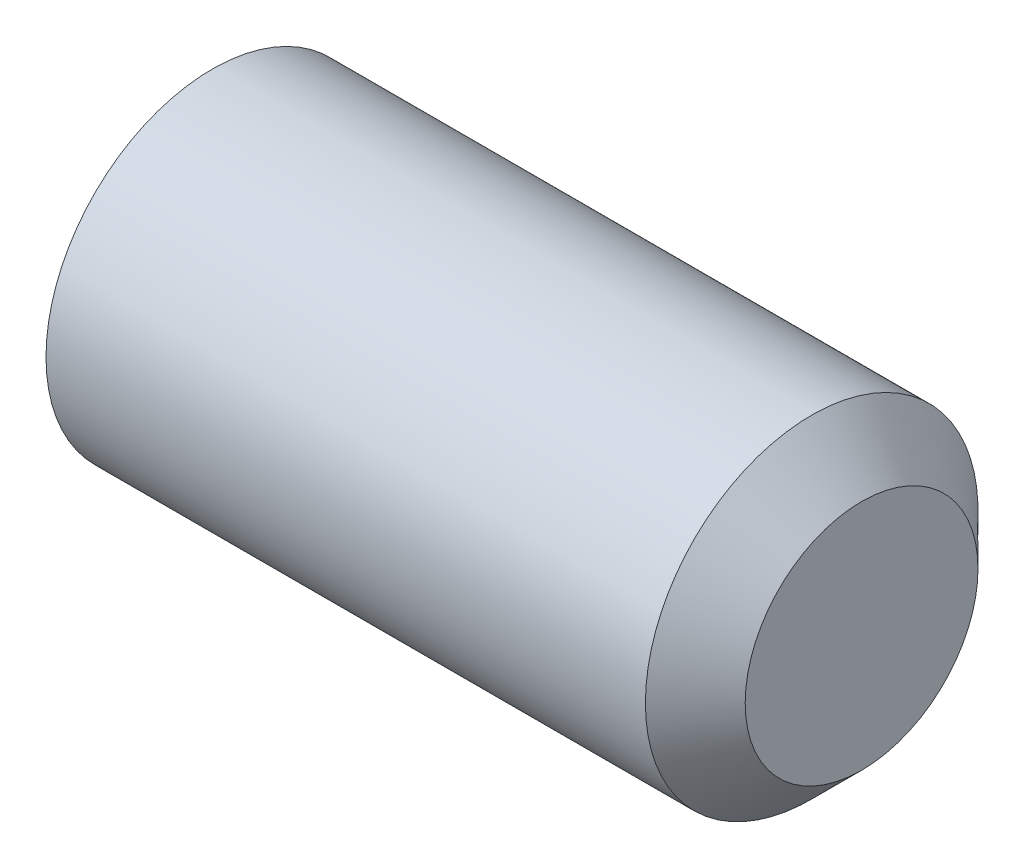
ISO-10303-21;
HEADER;
FILE_DESCRIPTION(('STEP AP214'),'2;1');
FILE_NAME('part.step','',(''),(''),'','','');
FILE_SCHEMA(('AUTOMOTIVE_DESIGN { 1 0 10303 214 1 1 1 1 }'));
ENDSEC;
DATA;
#1=APPLICATION_CONTEXT('core data for automotive mechanical design processes');
#2=APPLICATION_PROTOCOL_DEFINITION('international standard','automotive_design',2000,#1);
#3=PRODUCT_CONTEXT('',#1,'mechanical');
#4=PRODUCT('Part','Part','',(#3));
#5=PRODUCT_RELATED_PRODUCT_CATEGORY('part','',(#4));
#6=PRODUCT_DEFINITION_FORMATION('','',#4);
#7=PRODUCT_DEFINITION_CONTEXT('part definition',#1,'design');
#8=PRODUCT_DEFINITION('design','',#6,#7);
#9=PRODUCT_DEFINITION_SHAPE('','',#8);
#10=(LENGTH_UNIT() NAMED_UNIT(*) SI_UNIT(.MILLI.,.METRE.));
#11=(NAMED_UNIT(*) PLANE_ANGLE_UNIT() SI_UNIT($,.RADIAN.));
#12=(NAMED_UNIT(*) SI_UNIT($,.STERADIAN.) SOLID_ANGLE_UNIT());
#13=UNCERTAINTY_MEASURE_WITH_UNIT(LENGTH_MEASURE(1.E-05),#10,'distance_accuracy_value','');
#14=(GEOMETRIC_REPRESENTATION_CONTEXT(3) GLOBAL_UNCERTAINTY_ASSIGNED_CONTEXT((#13)) GLOBAL_UNIT_ASSIGNED_CONTEXT((#10,
#11,#12)) REPRESENTATION_CONTEXT('',''));
#15=CARTESIAN_POINT('',(0.,0.,0.));
#16=DIRECTION('',(0.,0.,1.));
#17=DIRECTION('',(1.,0.,0.));
#18=AXIS2_PLACEMENT_3D('',#15,#16,#17);
#19=CARTESIAN_POINT('',(0.,0.,0.));
#20=DIRECTION('',(-1.,0.,0.));
#21=DIRECTION('',(0.,0.,1.));
#22=AXIS2_PLACEMENT_3D('',#19,#20,#21);
#23=PLANE('',#22);
#24=CARTESIAN_POINT('',(0.,0.,0.));
#25=DIRECTION('',(-1.,0.,0.));
#26=DIRECTION('',(0.,0.,1.));
#27=AXIS2_PLACEMENT_3D('',#24,#25,#26);
#28=CIRCLE('',#27,4.172);
#29=CARTESIAN_POINT('',(0.,0.,4.172));
#30=VERTEX_POINT('',#29);
#31=EDGE_CURVE('E180',#30,#30,#28,.T.);
#32=ORIENTED_EDGE('',*,*,#31,.T.);
#33=EDGE_LOOP('',(#32));
#34=FACE_BOUND('',#33,.T.);
#35=DIRECTION('',(0.,0.,-1.));
#36=VECTOR('',#35,1.);
#37=CARTESIAN_POINT('',(0.,2.5,1.44337567297406));
#38=LINE('',#37,#36);
#39=CARTESIAN_POINT('',(0.,2.5,1.44337567297406));
#40=VERTEX_POINT('',#39);
#41=CARTESIAN_POINT('',(0.,2.5,-1.44337567297406));
#42=VERTEX_POINT('',#41);
#43=EDGE_CURVE('E165',#40,#42,#38,.T.);
#44=ORIENTED_EDGE('',*,*,#43,.F.);
#45=DIRECTION('',(0.,-0.866025403784438,0.500000000000001));
#46=VECTOR('',#45,1.);
#47=CARTESIAN_POINT('',(0.,2.5,1.44337567297406));
#48=LINE('',#47,#46);
#49=CARTESIAN_POINT('',(0.,0.,2.88675134594813));
#50=VERTEX_POINT('',#49);
#51=EDGE_CURVE('E78',#40,#50,#48,.T.);
#52=ORIENTED_EDGE('',*,*,#51,.T.);
#53=DIRECTION('',(0.,0.866025403784439,0.5));
#54=VECTOR('',#53,1.);
#55=CARTESIAN_POINT('',(0.,-2.5,1.44337567297407));
#56=LINE('',#55,#54);
#57=CARTESIAN_POINT('',(0.,-2.5,1.44337567297407));
#58=VERTEX_POINT('',#57);
#59=EDGE_CURVE('E152',#58,#50,#56,.T.);
#60=ORIENTED_EDGE('',*,*,#59,.F.);
#61=DIRECTION('',(0.,0.,-1.));
#62=VECTOR('',#61,1.);
#63=CARTESIAN_POINT('',(0.,-2.5,1.44337567297407));
#64=LINE('',#63,#62);
#65=CARTESIAN_POINT('',(0.,-2.5,-1.44337567297406));
#66=VERTEX_POINT('',#65);
#67=EDGE_CURVE('E156',#58,#66,#64,.T.);
#68=ORIENTED_EDGE('',*,*,#67,.T.);
#69=DIRECTION('',(0.,0.866025403784438,-0.500000000000001));
#70=VECTOR('',#69,1.);
#71=CARTESIAN_POINT('',(0.,-2.5,-1.44337567297406));
#72=LINE('',#71,#70);
#73=CARTESIAN_POINT('',(0.,0.,-2.88675134594813));
#74=VERTEX_POINT('',#73);
#75=EDGE_CURVE('E160',#66,#74,#72,.T.);
#76=ORIENTED_EDGE('',*,*,#75,.T.);
#77=DIRECTION('',(0.,-0.866025403784439,-0.5));
#78=VECTOR('',#77,1.);
#79=CARTESIAN_POINT('',(0.,2.5,-1.44337567297406));
#80=LINE('',#79,#78);
#81=EDGE_CURVE('E137',#42,#74,#80,.T.);
#82=ORIENTED_EDGE('',*,*,#81,.F.);
#83=EDGE_LOOP('',(#44,#52,#60,#68,#76,#82));
#84=FACE_BOUND('',#83,.T.);
#85=ADVANCED_FACE('F62',(#34,#84),#23,.T.);
#86=CARTESIAN_POINT('',(20.,3.5,0.));
#87=DIRECTION('',(1.,0.,0.));
#88=DIRECTION('',(0.,0.,-1.));
#89=AXIS2_PLACEMENT_3D('',#86,#87,#88);
#90=PLANE('',#89);
#91=CARTESIAN_POINT('',(20.,0.,0.));
#92=DIRECTION('',(-1.,0.,0.));
#93=DIRECTION('',(0.,0.,1.));
#94=AXIS2_PLACEMENT_3D('',#91,#92,#93);
#95=CIRCLE('',#94,3.5);
#96=CARTESIAN_POINT('',(20.,0.,3.5));
#97=VERTEX_POINT('',#96);
#98=EDGE_CURVE('E13',#97,#97,#95,.T.);
#99=ORIENTED_EDGE('',*,*,#98,.F.);
#100=EDGE_LOOP('',(#99));
#101=FACE_BOUND('',#100,.T.);
#102=ADVANCED_FACE('F64',(#101),#90,.T.);
#103=CARTESIAN_POINT('',(18.5,0.,0.));
#104=DIRECTION('',(-1.,0.,0.));
#105=DIRECTION('',(0.,0.,1.));
#106=AXIS2_PLACEMENT_3D('',#103,#104,#105);
#107=CONICAL_SURFACE('',#106,5.,0.785398163397454);
#108=ORIENTED_EDGE('',*,*,#98,.T.);
#109=EDGE_LOOP('',(#108));
#110=FACE_BOUND('',#109,.T.);
#111=CARTESIAN_POINT('',(18.5,0.,0.));
#112=DIRECTION('',(-1.,0.,0.));
#113=DIRECTION('',(0.,0.,1.));
#114=AXIS2_PLACEMENT_3D('',#111,#112,#113);
#115=CIRCLE('',#114,5.);
#116=CARTESIAN_POINT('',(18.5,0.,5.));
#117=VERTEX_POINT('',#116);
#118=EDGE_CURVE('E71',#117,#117,#115,.T.);
#119=ORIENTED_EDGE('',*,*,#118,.F.);
#120=EDGE_LOOP('',(#119));
#121=FACE_BOUND('',#120,.T.);
#122=ADVANCED_FACE('F194',(#110,#121),#107,.T.);
#123=CARTESIAN_POINT('',(-12.7,0.,0.));
#124=DIRECTION('',(-1.,0.,0.));
#125=DIRECTION('',(0.,0.,1.));
#126=AXIS2_PLACEMENT_3D('',#123,#124,#125);
#127=CYLINDRICAL_SURFACE('',#126,5.);
#128=ORIENTED_EDGE('',*,*,#118,.T.);
#129=EDGE_LOOP('',(#128));
#130=FACE_BOUND('',#129,.T.);
#131=CARTESIAN_POINT('',(0.478046022889009,0.,0.));
#132=DIRECTION('',(-1.,0.,0.));
#133=DIRECTION('',(0.,0.,1.));
#134=AXIS2_PLACEMENT_3D('',#131,#132,#133);
#135=CIRCLE('',#134,5.);
#136=CARTESIAN_POINT('',(0.478046022889009,0.,5.));
#137=VERTEX_POINT('',#136);
#138=EDGE_CURVE('E184',#137,#137,#135,.T.);
#139=ORIENTED_EDGE('',*,*,#138,.F.);
#140=EDGE_LOOP('',(#139));
#141=FACE_BOUND('',#140,.T.);
#142=ADVANCED_FACE('F191',(#130,#141),#127,.T.);
#143=CARTESIAN_POINT('',(0.,0.,0.));
#144=DIRECTION('',(1.,0.,0.));
#145=DIRECTION('',(0.,0.,-1.));
#146=AXIS2_PLACEMENT_3D('',#143,#144,#145);
#147=CONICAL_SURFACE('',#146,4.172,1.0471975511966);
#148=ORIENTED_EDGE('',*,*,#138,.T.);
#149=EDGE_LOOP('',(#148));
#150=FACE_BOUND('',#149,.T.);
#151=ORIENTED_EDGE('',*,*,#31,.F.);
#152=EDGE_LOOP('',(#151));
#153=FACE_BOUND('',#152,.T.);
#154=ADVANCED_FACE('F201',(#150,#153),#147,.T.);
#155=CARTESIAN_POINT('',(5.,2.5,1.44337567297406));
#156=DIRECTION('',(0.,-0.500000000000001,-0.866025403784438));
#157=DIRECTION('',(0.,0.866025403784438,-0.500000000000001));
#158=AXIS2_PLACEMENT_3D('',#155,#156,#157);
#159=PLANE('',#158);
#160=ORIENTED_EDGE('',*,*,#51,.F.);
#161=DIRECTION('',(-1.,0.,0.));
#162=VECTOR('',#161,1.);
#163=CARTESIAN_POINT('',(5.,2.5,1.44337567297406));
#164=LINE('',#163,#162);
#165=CARTESIAN_POINT('',(5.,2.5,1.44337567297406));
#166=VERTEX_POINT('',#165);
#167=EDGE_CURVE('E83',#166,#40,#164,.T.);
#168=ORIENTED_EDGE('',*,*,#167,.F.);
#169=DIRECTION('',(0.,-0.866025403784438,0.500000000000001));
#170=VECTOR('',#169,1.);
#171=CARTESIAN_POINT('',(5.,2.5,1.44337567297406));
#172=LINE('',#171,#170);
#173=CARTESIAN_POINT('',(5.,0.,2.88675134594813));
#174=VERTEX_POINT('',#173);
#175=EDGE_CURVE('E110',#166,#174,#172,.T.);
#176=ORIENTED_EDGE('',*,*,#175,.T.);
#177=DIRECTION('',(-1.,0.,0.));
#178=VECTOR('',#177,1.);
#179=CARTESIAN_POINT('',(5.,0.,2.88675134594813));
#180=LINE('',#179,#178);
#181=EDGE_CURVE('E177',#174,#50,#180,.T.);
#182=ORIENTED_EDGE('',*,*,#181,.T.);
#183=EDGE_LOOP('',(#160,#168,#176,#182));
#184=FACE_BOUND('',#183,.T.);
#185=ADVANCED_FACE('F215',(#184),#159,.T.);
#186=CARTESIAN_POINT('',(5.,-2.5,1.44337567297407));
#187=DIRECTION('',(0.,-0.5,0.866025403784439));
#188=DIRECTION('',(0.,-0.866025403784439,-0.5));
#189=AXIS2_PLACEMENT_3D('',#186,#187,#188);
#190=PLANE('',#189);
#191=ORIENTED_EDGE('',*,*,#59,.T.);
#192=ORIENTED_EDGE('',*,*,#181,.F.);
#193=DIRECTION('',(0.,0.866025403784439,0.5));
#194=VECTOR('',#193,1.);
#195=CARTESIAN_POINT('',(5.,-2.5,1.44337567297407));
#196=LINE('',#195,#194);
#197=CARTESIAN_POINT('',(5.,-2.5,1.44337567297407));
#198=VERTEX_POINT('',#197);
#199=EDGE_CURVE('E319',#198,#174,#196,.T.);
#200=ORIENTED_EDGE('',*,*,#199,.F.);
#201=DIRECTION('',(-1.,0.,0.));
#202=VECTOR('',#201,1.);
#203=CARTESIAN_POINT('',(5.,-2.5,1.44337567297407));
#204=LINE('',#203,#202);
#205=EDGE_CURVE('E174',#198,#58,#204,.T.);
#206=ORIENTED_EDGE('',*,*,#205,.T.);
#207=EDGE_LOOP('',(#191,#192,#200,#206));
#208=FACE_BOUND('',#207,.T.);
#209=ADVANCED_FACE('F221',(#208),#190,.F.);
#210=CARTESIAN_POINT('',(5.,-2.5,1.44337567297407));
#211=DIRECTION('',(0.,1.,0.));
#212=DIRECTION('',(0.,0.,1.));
#213=AXIS2_PLACEMENT_3D('',#210,#211,#212);
#214=PLANE('',#213);
#215=ORIENTED_EDGE('',*,*,#67,.F.);
#216=ORIENTED_EDGE('',*,*,#205,.F.);
#217=DIRECTION('',(0.,0.,-1.));
#218=VECTOR('',#217,1.);
#219=CARTESIAN_POINT('',(5.,-2.5,1.44337567297407));
#220=LINE('',#219,#218);
#221=CARTESIAN_POINT('',(5.,-2.5,-1.44337567297406));
#222=VERTEX_POINT('',#221);
#223=EDGE_CURVE('E132',#198,#222,#220,.T.);
#224=ORIENTED_EDGE('',*,*,#223,.T.);
#225=DIRECTION('',(-1.,0.,0.));
#226=VECTOR('',#225,1.);
#227=CARTESIAN_POINT('',(5.,-2.5,-1.44337567297406));
#228=LINE('',#227,#226);
#229=EDGE_CURVE('E126',#222,#66,#228,.T.);
#230=ORIENTED_EDGE('',*,*,#229,.T.);
#231=EDGE_LOOP('',(#215,#216,#224,#230));
#232=FACE_BOUND('',#231,.T.);
#233=ADVANCED_FACE('F228',(#232),#214,.T.);
#234=CARTESIAN_POINT('',(5.,-2.5,-1.44337567297406));
#235=DIRECTION('',(0.,0.500000000000001,0.866025403784438));
#236=DIRECTION('',(0.,-0.866025403784438,0.500000000000001));
#237=AXIS2_PLACEMENT_3D('',#234,#235,#236);
#238=PLANE('',#237);
#239=ORIENTED_EDGE('',*,*,#75,.F.);
#240=ORIENTED_EDGE('',*,*,#229,.F.);
#241=DIRECTION('',(0.,0.866025403784438,-0.500000000000001));
#242=VECTOR('',#241,1.);
#243=CARTESIAN_POINT('',(5.,-2.5,-1.44337567297406));
#244=LINE('',#243,#242);
#245=CARTESIAN_POINT('',(5.,0.,-2.88675134594813));
#246=VERTEX_POINT('',#245);
#247=EDGE_CURVE('E121',#222,#246,#244,.T.);
#248=ORIENTED_EDGE('',*,*,#247,.T.);
#249=DIRECTION('',(-1.,0.,0.));
#250=VECTOR('',#249,1.);
#251=CARTESIAN_POINT('',(5.,0.,-2.88675134594813));
#252=LINE('',#251,#250);
#253=EDGE_CURVE('E125',#246,#74,#252,.T.);
#254=ORIENTED_EDGE('',*,*,#253,.T.);
#255=EDGE_LOOP('',(#239,#240,#248,#254));
#256=FACE_BOUND('',#255,.T.);
#257=ADVANCED_FACE('F124',(#256),#238,.T.);
#258=CARTESIAN_POINT('',(5.,2.5,-1.44337567297406));
#259=DIRECTION('',(0.,0.5,-0.866025403784438));
#260=DIRECTION('',(0.,0.866025403784439,0.5));
#261=AXIS2_PLACEMENT_3D('',#258,#259,#260);
#262=PLANE('',#261);
#263=ORIENTED_EDGE('',*,*,#81,.T.);
#264=ORIENTED_EDGE('',*,*,#253,.F.);
#265=DIRECTION('',(0.,-0.866025403784439,-0.5));
#266=VECTOR('',#265,1.);
#267=CARTESIAN_POINT('',(5.,2.5,-1.44337567297406));
#268=LINE('',#267,#266);
#269=CARTESIAN_POINT('',(5.,2.5,-1.44337567297406));
#270=VERTEX_POINT('',#269);
#271=EDGE_CURVE('E131',#270,#246,#268,.T.);
#272=ORIENTED_EDGE('',*,*,#271,.F.);
#273=DIRECTION('',(-1.,0.,0.));
#274=VECTOR('',#273,1.);
#275=CARTESIAN_POINT('',(5.,2.5,-1.44337567297406));
#276=LINE('',#275,#274);
#277=EDGE_CURVE('E106',#270,#42,#276,.T.);
#278=ORIENTED_EDGE('',*,*,#277,.T.);
#279=EDGE_LOOP('',(#263,#264,#272,#278));
#280=FACE_BOUND('',#279,.T.);
#281=ADVANCED_FACE('F134',(#280),#262,.F.);
#282=CARTESIAN_POINT('',(5.,2.5,1.44337567297406));
#283=DIRECTION('',(0.,1.,0.));
#284=DIRECTION('',(0.,0.,1.));
#285=AXIS2_PLACEMENT_3D('',#282,#283,#284);
#286=PLANE('',#285);
#287=ORIENTED_EDGE('',*,*,#43,.T.);
#288=ORIENTED_EDGE('',*,*,#277,.F.);
#289=DIRECTION('',(0.,0.,-1.));
#290=VECTOR('',#289,1.);
#291=CARTESIAN_POINT('',(5.,2.5,1.44337567297406));
#292=LINE('',#291,#290);
#293=EDGE_CURVE('E143',#166,#270,#292,.T.);
#294=ORIENTED_EDGE('',*,*,#293,.F.);
#295=ORIENTED_EDGE('',*,*,#167,.T.);
#296=EDGE_LOOP('',(#287,#288,#294,#295));
#297=FACE_BOUND('',#296,.T.);
#298=ADVANCED_FACE('F240',(#297),#286,.F.);
#299=CARTESIAN_POINT('',(5.,5.,0.));
#300=DIRECTION('',(1.,0.,0.));
#301=DIRECTION('',(0.,0.,-1.));
#302=AXIS2_PLACEMENT_3D('',#299,#300,#301);
#303=PLANE('',#302);
#304=ORIENTED_EDGE('',*,*,#175,.F.);
#305=ORIENTED_EDGE('',*,*,#293,.T.);
#306=ORIENTED_EDGE('',*,*,#271,.T.);
#307=ORIENTED_EDGE('',*,*,#247,.F.);
#308=ORIENTED_EDGE('',*,*,#223,.F.);
#309=ORIENTED_EDGE('',*,*,#199,.T.);
#310=EDGE_LOOP('',(#304,#305,#306,#307,#308,#309));
#311=FACE_BOUND('',#310,.T.);
#312=ADVANCED_FACE('F141',(#311),#303,.F.);
#313=CLOSED_SHELL('',(#85,#102,#122,#142,#154,#185,#209,#233,#257,#281,#298,#312));
#314=MANIFOLD_SOLID_BREP('B2',#313);
#315=ADVANCED_BREP_SHAPE_REPRESENTATION('',(#18,#314),#14);
#316=SHAPE_DEFINITION_REPRESENTATION(#9,#315);
ENDSEC;
END-ISO-10303-21;
